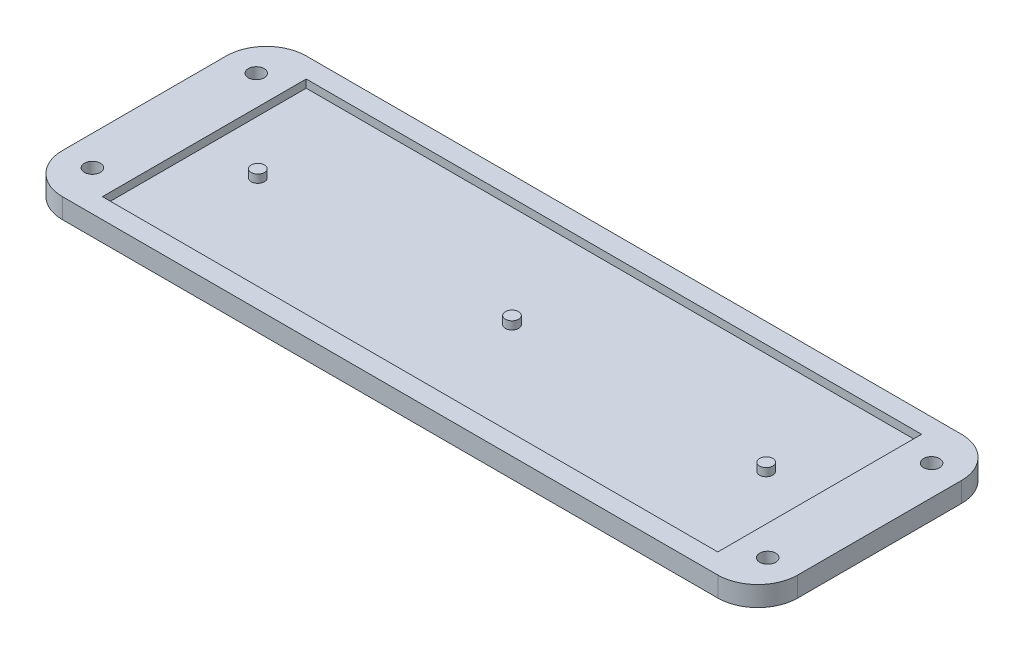
ISO-10303-21;
HEADER;
FILE_DESCRIPTION(('STEP AP214'),'2;1');
FILE_NAME('part.step','',(''),(''),'','','');
FILE_SCHEMA(('AUTOMOTIVE_DESIGN { 1 0 10303 214 1 1 1 1 }'));
ENDSEC;
DATA;
#1=APPLICATION_CONTEXT('core data for automotive mechanical design processes');
#2=APPLICATION_PROTOCOL_DEFINITION('international standard','automotive_design',2000,#1);
#3=PRODUCT_CONTEXT('',#1,'mechanical');
#4=PRODUCT('Part','Part','',(#3));
#5=PRODUCT_RELATED_PRODUCT_CATEGORY('part','',(#4));
#6=PRODUCT_DEFINITION_FORMATION('','',#4);
#7=PRODUCT_DEFINITION_CONTEXT('part definition',#1,'design');
#8=PRODUCT_DEFINITION('design','',#6,#7);
#9=PRODUCT_DEFINITION_SHAPE('','',#8);
#10=(LENGTH_UNIT() NAMED_UNIT(*) SI_UNIT(.MILLI.,.METRE.));
#11=(NAMED_UNIT(*) PLANE_ANGLE_UNIT() SI_UNIT($,.RADIAN.));
#12=(NAMED_UNIT(*) SI_UNIT($,.STERADIAN.) SOLID_ANGLE_UNIT());
#13=UNCERTAINTY_MEASURE_WITH_UNIT(LENGTH_MEASURE(1.E-05),#10,'distance_accuracy_value','');
#14=(GEOMETRIC_REPRESENTATION_CONTEXT(3) GLOBAL_UNCERTAINTY_ASSIGNED_CONTEXT((#13)) GLOBAL_UNIT_ASSIGNED_CONTEXT((#10,
#11,#12)) REPRESENTATION_CONTEXT('',''));
#15=CARTESIAN_POINT('',(0.,0.,0.));
#16=DIRECTION('',(0.,0.,1.));
#17=DIRECTION('',(1.,0.,0.));
#18=AXIS2_PLACEMENT_3D('',#15,#16,#17);
#19=CARTESIAN_POINT('',(0.,5.,0.));
#20=DIRECTION('',(0.,1.,0.));
#21=DIRECTION('',(0.,0.,1.));
#22=AXIS2_PLACEMENT_3D('',#19,#20,#21);
#23=PLANE('',#22);
#24=DIRECTION('',(0.,0.,-1.));
#25=VECTOR('',#24,1.);
#26=CARTESIAN_POINT('',(169.,5.,-56.));
#27=LINE('',#26,#25);
#28=CARTESIAN_POINT('',(169.,5.,-5.00000000000001));
#29=VERTEX_POINT('',#28);
#30=CARTESIAN_POINT('',(169.,5.,-56.));
#31=VERTEX_POINT('',#30);
#32=EDGE_CURVE('E140',#29,#31,#27,.T.);
#33=ORIENTED_EDGE('',*,*,#32,.F.);
#34=DIRECTION('',(1.,0.,0.));
#35=VECTOR('',#34,1.);
#36=CARTESIAN_POINT('',(15.,5.,-5.00000000000001));
#37=LINE('',#36,#35);
#38=CARTESIAN_POINT('',(15.,5.,-5.00000000000001));
#39=VERTEX_POINT('',#38);
#40=EDGE_CURVE('E160',#39,#29,#37,.T.);
#41=ORIENTED_EDGE('',*,*,#40,.F.);
#42=DIRECTION('',(0.,0.,1.));
#43=VECTOR('',#42,1.);
#44=CARTESIAN_POINT('',(15.,5.,-56.));
#45=LINE('',#44,#43);
#46=CARTESIAN_POINT('',(15.,5.,-56.));
#47=VERTEX_POINT('',#46);
#48=EDGE_CURVE('E164',#47,#39,#45,.T.);
#49=ORIENTED_EDGE('',*,*,#48,.F.);
#50=DIRECTION('',(-1.,0.,0.));
#51=VECTOR('',#50,1.);
#52=CARTESIAN_POINT('',(15.,5.,-56.));
#53=LINE('',#52,#51);
#54=EDGE_CURVE('E176',#31,#47,#53,.T.);
#55=ORIENTED_EDGE('',*,*,#54,.F.);
#56=EDGE_LOOP('',(#33,#41,#49,#55));
#57=FACE_BOUND('',#56,.T.);
#58=CARTESIAN_POINT('',(176.5,5.,-51.0000000000001));
#59=DIRECTION('',(0.,1.,0.));
#60=DIRECTION('',(0.,0.,1.));
#61=AXIS2_PLACEMENT_3D('',#58,#59,#60);
#62=CIRCLE('',#61,2.);
#63=CARTESIAN_POINT('',(176.5,5.,-49.0000000000001));
#64=VERTEX_POINT('',#63);
#65=EDGE_CURVE('E200',#64,#64,#62,.T.);
#66=ORIENTED_EDGE('',*,*,#65,.F.);
#67=EDGE_LOOP('',(#66));
#68=FACE_BOUND('',#67,.T.);
#69=CARTESIAN_POINT('',(176.5,5.,-10.));
#70=DIRECTION('',(0.,1.,0.));
#71=DIRECTION('',(0.,0.,-1.));
#72=AXIS2_PLACEMENT_3D('',#69,#70,#71);
#73=CIRCLE('',#72,2.);
#74=CARTESIAN_POINT('',(176.5,5.,-12.));
#75=VERTEX_POINT('',#74);
#76=EDGE_CURVE('E216',#75,#75,#73,.T.);
#77=ORIENTED_EDGE('',*,*,#76,.F.);
#78=EDGE_LOOP('',(#77));
#79=FACE_BOUND('',#78,.T.);
#80=DIRECTION('',(-1.,0.,0.));
#81=VECTOR('',#80,1.);
#82=CARTESIAN_POINT('',(184.,5.,-61.));
#83=LINE('',#82,#81);
#84=CARTESIAN_POINT('',(174.,5.,-61.));
#85=VERTEX_POINT('',#84);
#86=CARTESIAN_POINT('',(10.,5.,-61.));
#87=VERTEX_POINT('',#86);
#88=EDGE_CURVE('E235',#85,#87,#83,.T.);
#89=ORIENTED_EDGE('',*,*,#88,.T.);
#90=CARTESIAN_POINT('',(10.,5.,-51.));
#91=DIRECTION('',(0.,1.,0.));
#92=DIRECTION('',(0.,0.,1.));
#93=AXIS2_PLACEMENT_3D('',#90,#91,#92);
#94=CIRCLE('',#93,10.);
#95=CARTESIAN_POINT('',(0.,5.,-51.));
#96=VERTEX_POINT('',#95);
#97=EDGE_CURVE('E286',#87,#96,#94,.T.);
#98=ORIENTED_EDGE('',*,*,#97,.T.);
#99=DIRECTION('',(0.,0.,1.));
#100=VECTOR('',#99,1.);
#101=CARTESIAN_POINT('',(0.,5.,-61.));
#102=LINE('',#101,#100);
#103=CARTESIAN_POINT('',(0.,5.,-10.));
#104=VERTEX_POINT('',#103);
#105=EDGE_CURVE('E224',#96,#104,#102,.T.);
#106=ORIENTED_EDGE('',*,*,#105,.T.);
#107=CARTESIAN_POINT('',(10.,5.,-10.));
#108=DIRECTION('',(0.,1.,0.));
#109=DIRECTION('',(0.,0.,1.));
#110=AXIS2_PLACEMENT_3D('',#107,#108,#109);
#111=CIRCLE('',#110,10.);
#112=CARTESIAN_POINT('',(10.,5.,0.));
#113=VERTEX_POINT('',#112);
#114=EDGE_CURVE('E283',#104,#113,#111,.T.);
#115=ORIENTED_EDGE('',*,*,#114,.T.);
#116=DIRECTION('',(1.,0.,0.));
#117=VECTOR('',#116,1.);
#118=CARTESIAN_POINT('',(0.,5.,0.));
#119=LINE('',#118,#117);
#120=CARTESIAN_POINT('',(174.,5.,0.));
#121=VERTEX_POINT('',#120);
#122=EDGE_CURVE('E228',#113,#121,#119,.T.);
#123=ORIENTED_EDGE('',*,*,#122,.T.);
#124=CARTESIAN_POINT('',(174.,5.,-9.99999999999998));
#125=DIRECTION('',(0.,1.,0.));
#126=DIRECTION('',(0.,0.,1.));
#127=AXIS2_PLACEMENT_3D('',#124,#125,#126);
#128=CIRCLE('',#127,10.);
#129=CARTESIAN_POINT('',(184.,5.,-9.99999999999998));
#130=VERTEX_POINT('',#129);
#131=EDGE_CURVE('E64',#121,#130,#128,.T.);
#132=ORIENTED_EDGE('',*,*,#131,.T.);
#133=DIRECTION('',(0.,0.,-1.));
#134=VECTOR('',#133,1.);
#135=CARTESIAN_POINT('',(184.,5.,0.));
#136=LINE('',#135,#134);
#137=CARTESIAN_POINT('',(184.,5.,-51.));
#138=VERTEX_POINT('',#137);
#139=EDGE_CURVE('E232',#130,#138,#136,.T.);
#140=ORIENTED_EDGE('',*,*,#139,.T.);
#141=CARTESIAN_POINT('',(174.,5.,-51.));
#142=DIRECTION('',(0.,1.,0.));
#143=DIRECTION('',(0.,0.,1.));
#144=AXIS2_PLACEMENT_3D('',#141,#142,#143);
#145=CIRCLE('',#144,10.);
#146=EDGE_CURVE('E280',#138,#85,#145,.T.);
#147=ORIENTED_EDGE('',*,*,#146,.T.);
#148=EDGE_LOOP('',(#89,#98,#106,#115,#123,#132,#140,#147));
#149=FACE_BOUND('',#148,.T.);
#150=CARTESIAN_POINT('',(7.50000000000001,5.,-10.));
#151=DIRECTION('',(0.,1.,0.));
#152=DIRECTION('',(0.,0.,1.));
#153=AXIS2_PLACEMENT_3D('',#150,#151,#152);
#154=CIRCLE('',#153,2.);
#155=CARTESIAN_POINT('',(7.50000000000001,5.,-8.));
#156=VERTEX_POINT('',#155);
#157=EDGE_CURVE('E208',#156,#156,#154,.T.);
#158=ORIENTED_EDGE('',*,*,#157,.F.);
#159=EDGE_LOOP('',(#158));
#160=FACE_BOUND('',#159,.T.);
#161=CARTESIAN_POINT('',(7.5,5.,-51.));
#162=DIRECTION('',(0.,1.,0.));
#163=DIRECTION('',(0.,0.,-1.));
#164=AXIS2_PLACEMENT_3D('',#161,#162,#163);
#165=CIRCLE('',#164,2.);
#166=CARTESIAN_POINT('',(7.5,5.,-53.));
#167=VERTEX_POINT('',#166);
#168=EDGE_CURVE('E192',#167,#167,#165,.T.);
#169=ORIENTED_EDGE('',*,*,#168,.F.);
#170=EDGE_LOOP('',(#169));
#171=FACE_BOUND('',#170,.T.);
#172=ADVANCED_FACE('F43',(#57,#68,#79,#149,#160,#171),#23,.T.);
#173=CARTESIAN_POINT('',(0.,0.,0.));
#174=DIRECTION('',(0.,1.,0.));
#175=DIRECTION('',(0.,0.,1.));
#176=AXIS2_PLACEMENT_3D('',#173,#174,#175);
#177=PLANE('',#176);
#178=DIRECTION('',(0.,0.,1.));
#179=VECTOR('',#178,1.);
#180=CARTESIAN_POINT('',(0.,0.,-61.));
#181=LINE('',#180,#179);
#182=CARTESIAN_POINT('',(0.,0.,-51.));
#183=VERTEX_POINT('',#182);
#184=CARTESIAN_POINT('',(0.,0.,-10.));
#185=VERTEX_POINT('',#184);
#186=EDGE_CURVE('E220',#183,#185,#181,.T.);
#187=ORIENTED_EDGE('',*,*,#186,.F.);
#188=CARTESIAN_POINT('',(10.,0.,-51.));
#189=DIRECTION('',(0.,1.,0.));
#190=DIRECTION('',(0.,0.,1.));
#191=AXIS2_PLACEMENT_3D('',#188,#189,#190);
#192=CIRCLE('',#191,10.);
#193=CARTESIAN_POINT('',(10.,0.,-61.));
#194=VERTEX_POINT('',#193);
#195=EDGE_CURVE('E268',#183,#194,#192,.F.);
#196=ORIENTED_EDGE('',*,*,#195,.T.);
#197=DIRECTION('',(-1.,0.,0.));
#198=VECTOR('',#197,1.);
#199=CARTESIAN_POINT('',(184.,0.,-61.));
#200=LINE('',#199,#198);
#201=CARTESIAN_POINT('',(174.,0.,-61.));
#202=VERTEX_POINT('',#201);
#203=EDGE_CURVE('E229',#202,#194,#200,.T.);
#204=ORIENTED_EDGE('',*,*,#203,.F.);
#205=CARTESIAN_POINT('',(174.,0.,-51.));
#206=DIRECTION('',(0.,1.,0.));
#207=DIRECTION('',(0.,0.,1.));
#208=AXIS2_PLACEMENT_3D('',#205,#206,#207);
#209=CIRCLE('',#208,10.);
#210=CARTESIAN_POINT('',(184.,0.,-51.));
#211=VERTEX_POINT('',#210);
#212=EDGE_CURVE('E262',#202,#211,#209,.F.);
#213=ORIENTED_EDGE('',*,*,#212,.T.);
#214=DIRECTION('',(0.,0.,-1.));
#215=VECTOR('',#214,1.);
#216=CARTESIAN_POINT('',(184.,0.,0.));
#217=LINE('',#216,#215);
#218=CARTESIAN_POINT('',(184.,0.,-9.99999999999998));
#219=VERTEX_POINT('',#218);
#220=EDGE_CURVE('E247',#219,#211,#217,.T.);
#221=ORIENTED_EDGE('',*,*,#220,.F.);
#222=CARTESIAN_POINT('',(174.,0.,-9.99999999999998));
#223=DIRECTION('',(0.,1.,0.));
#224=DIRECTION('',(0.,0.,1.));
#225=AXIS2_PLACEMENT_3D('',#222,#223,#224);
#226=CIRCLE('',#225,10.);
#227=CARTESIAN_POINT('',(174.,0.,0.));
#228=VERTEX_POINT('',#227);
#229=EDGE_CURVE('E259',#219,#228,#226,.F.);
#230=ORIENTED_EDGE('',*,*,#229,.T.);
#231=DIRECTION('',(1.,0.,0.));
#232=VECTOR('',#231,1.);
#233=CARTESIAN_POINT('',(0.,0.,0.));
#234=LINE('',#233,#232);
#235=CARTESIAN_POINT('',(10.,0.,0.));
#236=VERTEX_POINT('',#235);
#237=EDGE_CURVE('E243',#236,#228,#234,.T.);
#238=ORIENTED_EDGE('',*,*,#237,.F.);
#239=CARTESIAN_POINT('',(10.,0.,-10.));
#240=DIRECTION('',(0.,1.,0.));
#241=DIRECTION('',(0.,0.,1.));
#242=AXIS2_PLACEMENT_3D('',#239,#240,#241);
#243=CIRCLE('',#242,10.);
#244=EDGE_CURVE('E265',#236,#185,#243,.F.);
#245=ORIENTED_EDGE('',*,*,#244,.T.);
#246=EDGE_LOOP('',(#187,#196,#204,#213,#221,#230,#238,#245));
#247=FACE_BOUND('',#246,.T.);
#248=CARTESIAN_POINT('',(176.5,0.,-10.));
#249=DIRECTION('',(0.,1.,0.));
#250=DIRECTION('',(0.,0.,-1.));
#251=AXIS2_PLACEMENT_3D('',#248,#249,#250);
#252=CIRCLE('',#251,2.);
#253=CARTESIAN_POINT('',(176.5,0.,-12.));
#254=VERTEX_POINT('',#253);
#255=EDGE_CURVE('E212',#254,#254,#252,.T.);
#256=ORIENTED_EDGE('',*,*,#255,.T.);
#257=EDGE_LOOP('',(#256));
#258=FACE_BOUND('',#257,.T.);
#259=CARTESIAN_POINT('',(7.50000000000001,0.,-10.));
#260=DIRECTION('',(0.,1.,0.));
#261=DIRECTION('',(0.,0.,1.));
#262=AXIS2_PLACEMENT_3D('',#259,#260,#261);
#263=CIRCLE('',#262,2.);
#264=CARTESIAN_POINT('',(7.50000000000001,0.,-8.));
#265=VERTEX_POINT('',#264);
#266=EDGE_CURVE('E204',#265,#265,#263,.T.);
#267=ORIENTED_EDGE('',*,*,#266,.T.);
#268=EDGE_LOOP('',(#267));
#269=FACE_BOUND('',#268,.T.);
#270=CARTESIAN_POINT('',(176.5,0.,-51.0000000000001));
#271=DIRECTION('',(0.,1.,0.));
#272=DIRECTION('',(0.,0.,1.));
#273=AXIS2_PLACEMENT_3D('',#270,#271,#272);
#274=CIRCLE('',#273,2.);
#275=CARTESIAN_POINT('',(176.5,0.,-49.0000000000001));
#276=VERTEX_POINT('',#275);
#277=EDGE_CURVE('E196',#276,#276,#274,.T.);
#278=ORIENTED_EDGE('',*,*,#277,.T.);
#279=EDGE_LOOP('',(#278));
#280=FACE_BOUND('',#279,.T.);
#281=CARTESIAN_POINT('',(7.5,0.,-51.));
#282=DIRECTION('',(0.,1.,0.));
#283=DIRECTION('',(0.,0.,-1.));
#284=AXIS2_PLACEMENT_3D('',#281,#282,#283);
#285=CIRCLE('',#284,2.);
#286=CARTESIAN_POINT('',(7.5,0.,-53.));
#287=VERTEX_POINT('',#286);
#288=EDGE_CURVE('E186',#287,#287,#285,.T.);
#289=ORIENTED_EDGE('',*,*,#288,.T.);
#290=EDGE_LOOP('',(#289));
#291=FACE_BOUND('',#290,.T.);
#292=ADVANCED_FACE('F303',(#247,#258,#269,#280,#291),#177,.F.);
#293=CARTESIAN_POINT('',(0.,5.,-61.));
#294=DIRECTION('',(1.,0.,0.));
#295=DIRECTION('',(0.,0.,-1.));
#296=AXIS2_PLACEMENT_3D('',#293,#294,#295);
#297=PLANE('',#296);
#298=ORIENTED_EDGE('',*,*,#105,.F.);
#299=DIRECTION('',(0.,-1.,0.));
#300=VECTOR('',#299,1.);
#301=CARTESIAN_POINT('',(0.,5.,-51.));
#302=LINE('',#301,#300);
#303=EDGE_CURVE('E255',#96,#183,#302,.T.);
#304=ORIENTED_EDGE('',*,*,#303,.T.);
#305=ORIENTED_EDGE('',*,*,#186,.T.);
#306=DIRECTION('',(0.,-1.,0.));
#307=VECTOR('',#306,1.);
#308=CARTESIAN_POINT('',(0.,5.,-9.99999999999999));
#309=LINE('',#308,#307);
#310=EDGE_CURVE('E239',#185,#104,#309,.F.);
#311=ORIENTED_EDGE('',*,*,#310,.T.);
#312=EDGE_LOOP('',(#298,#304,#305,#311));
#313=FACE_BOUND('',#312,.T.);
#314=ADVANCED_FACE('F322',(#313),#297,.F.);
#315=CARTESIAN_POINT('',(0.,5.,0.));
#316=DIRECTION('',(0.,0.,-1.));
#317=DIRECTION('',(-1.,0.,0.));
#318=AXIS2_PLACEMENT_3D('',#315,#316,#317);
#319=PLANE('',#318);
#320=ORIENTED_EDGE('',*,*,#122,.F.);
#321=DIRECTION('',(0.,-1.,0.));
#322=VECTOR('',#321,1.);
#323=CARTESIAN_POINT('',(10.,5.,0.));
#324=LINE('',#323,#322);
#325=EDGE_CURVE('E292',#113,#236,#324,.T.);
#326=ORIENTED_EDGE('',*,*,#325,.T.);
#327=ORIENTED_EDGE('',*,*,#237,.T.);
#328=DIRECTION('',(0.,-1.,0.));
#329=VECTOR('',#328,1.);
#330=CARTESIAN_POINT('',(174.,5.,0.));
#331=LINE('',#330,#329);
#332=EDGE_CURVE('E289',#228,#121,#331,.F.);
#333=ORIENTED_EDGE('',*,*,#332,.T.);
#334=EDGE_LOOP('',(#320,#326,#327,#333));
#335=FACE_BOUND('',#334,.T.);
#336=ADVANCED_FACE('F330',(#335),#319,.F.);
#337=CARTESIAN_POINT('',(184.,5.,0.));
#338=DIRECTION('',(-1.,0.,0.));
#339=DIRECTION('',(0.,0.,1.));
#340=AXIS2_PLACEMENT_3D('',#337,#338,#339);
#341=PLANE('',#340);
#342=ORIENTED_EDGE('',*,*,#220,.T.);
#343=DIRECTION('',(0.,-1.,0.));
#344=VECTOR('',#343,1.);
#345=CARTESIAN_POINT('',(184.,5.,-51.));
#346=LINE('',#345,#344);
#347=EDGE_CURVE('E11',#211,#138,#346,.F.);
#348=ORIENTED_EDGE('',*,*,#347,.T.);
#349=ORIENTED_EDGE('',*,*,#139,.F.);
#350=DIRECTION('',(0.,-1.,0.));
#351=VECTOR('',#350,1.);
#352=CARTESIAN_POINT('',(184.,5.,-9.99999999999998));
#353=LINE('',#352,#351);
#354=EDGE_CURVE('E52',#130,#219,#353,.T.);
#355=ORIENTED_EDGE('',*,*,#354,.T.);
#356=EDGE_LOOP('',(#342,#348,#349,#355));
#357=FACE_BOUND('',#356,.T.);
#358=ADVANCED_FACE('F299',(#357),#341,.F.);
#359=CARTESIAN_POINT('',(184.,5.,-61.));
#360=DIRECTION('',(0.,0.,1.));
#361=DIRECTION('',(1.,0.,0.));
#362=AXIS2_PLACEMENT_3D('',#359,#360,#361);
#363=PLANE('',#362);
#364=ORIENTED_EDGE('',*,*,#203,.T.);
#365=DIRECTION('',(0.,-1.,0.));
#366=VECTOR('',#365,1.);
#367=CARTESIAN_POINT('',(10.,5.,-61.));
#368=LINE('',#367,#366);
#369=EDGE_CURVE('E275',#194,#87,#368,.F.);
#370=ORIENTED_EDGE('',*,*,#369,.T.);
#371=ORIENTED_EDGE('',*,*,#88,.F.);
#372=DIRECTION('',(0.,-1.,0.));
#373=VECTOR('',#372,1.);
#374=CARTESIAN_POINT('',(174.,5.,-61.));
#375=LINE('',#374,#373);
#376=EDGE_CURVE('E271',#85,#202,#375,.T.);
#377=ORIENTED_EDGE('',*,*,#376,.T.);
#378=EDGE_LOOP('',(#364,#370,#371,#377));
#379=FACE_BOUND('',#378,.T.);
#380=ADVANCED_FACE('F313',(#379),#363,.F.);
#381=CARTESIAN_POINT('',(176.5,5.,-10.));
#382=DIRECTION('',(0.,-1.,0.));
#383=DIRECTION('',(0.,0.,-1.));
#384=AXIS2_PLACEMENT_3D('',#381,#382,#383);
#385=CYLINDRICAL_SURFACE('',#384,2.);
#386=ORIENTED_EDGE('',*,*,#76,.T.);
#387=EDGE_LOOP('',(#386));
#388=FACE_BOUND('',#387,.T.);
#389=ORIENTED_EDGE('',*,*,#255,.F.);
#390=EDGE_LOOP('',(#389));
#391=FACE_BOUND('',#390,.T.);
#392=ADVANCED_FACE('F424',(#388,#391),#385,.F.);
#393=CARTESIAN_POINT('',(7.50000000000001,5.,-10.));
#394=DIRECTION('',(0.,-1.,0.));
#395=DIRECTION('',(0.,0.,-1.));
#396=AXIS2_PLACEMENT_3D('',#393,#394,#395);
#397=CYLINDRICAL_SURFACE('',#396,2.);
#398=ORIENTED_EDGE('',*,*,#157,.T.);
#399=EDGE_LOOP('',(#398));
#400=FACE_BOUND('',#399,.T.);
#401=ORIENTED_EDGE('',*,*,#266,.F.);
#402=EDGE_LOOP('',(#401));
#403=FACE_BOUND('',#402,.T.);
#404=ADVANCED_FACE('F421',(#400,#403),#397,.F.);
#405=CARTESIAN_POINT('',(176.5,5.,-51.0000000000001));
#406=DIRECTION('',(0.,-1.,0.));
#407=DIRECTION('',(0.,0.,-1.));
#408=AXIS2_PLACEMENT_3D('',#405,#406,#407);
#409=CYLINDRICAL_SURFACE('',#408,2.);
#410=ORIENTED_EDGE('',*,*,#65,.T.);
#411=EDGE_LOOP('',(#410));
#412=FACE_BOUND('',#411,.T.);
#413=ORIENTED_EDGE('',*,*,#277,.F.);
#414=EDGE_LOOP('',(#413));
#415=FACE_BOUND('',#414,.T.);
#416=ADVANCED_FACE('F417',(#412,#415),#409,.F.);
#417=CARTESIAN_POINT('',(7.5,5.,-51.));
#418=DIRECTION('',(0.,-1.,0.));
#419=DIRECTION('',(0.,0.,-1.));
#420=AXIS2_PLACEMENT_3D('',#417,#418,#419);
#421=CYLINDRICAL_SURFACE('',#420,2.);
#422=ORIENTED_EDGE('',*,*,#168,.T.);
#423=EDGE_LOOP('',(#422));
#424=FACE_BOUND('',#423,.T.);
#425=ORIENTED_EDGE('',*,*,#288,.F.);
#426=EDGE_LOOP('',(#425));
#427=FACE_BOUND('',#426,.T.);
#428=ADVANCED_FACE('F414',(#424,#427),#421,.F.);
#429=CARTESIAN_POINT('',(169.,3.,-56.));
#430=DIRECTION('',(1.,0.,0.));
#431=DIRECTION('',(0.,0.,-1.));
#432=AXIS2_PLACEMENT_3D('',#429,#430,#431);
#433=PLANE('',#432);
#434=ORIENTED_EDGE('',*,*,#32,.T.);
#435=DIRECTION('',(0.,1.,0.));
#436=VECTOR('',#435,1.);
#437=CARTESIAN_POINT('',(169.,3.,-56.));
#438=LINE('',#437,#436);
#439=CARTESIAN_POINT('',(169.,3.,-56.));
#440=VERTEX_POINT('',#439);
#441=EDGE_CURVE('E133',#440,#31,#438,.T.);
#442=ORIENTED_EDGE('',*,*,#441,.F.);
#443=DIRECTION('',(0.,0.,-1.));
#444=VECTOR('',#443,1.);
#445=CARTESIAN_POINT('',(169.,3.,-56.));
#446=LINE('',#445,#444);
#447=CARTESIAN_POINT('',(169.,3.,-5.00000000000001));
#448=VERTEX_POINT('',#447);
#449=EDGE_CURVE('E137',#448,#440,#446,.T.);
#450=ORIENTED_EDGE('',*,*,#449,.F.);
#451=DIRECTION('',(0.,1.,0.));
#452=VECTOR('',#451,1.);
#453=CARTESIAN_POINT('',(169.,3.,-5.00000000000001));
#454=LINE('',#453,#452);
#455=EDGE_CURVE('E183',#448,#29,#454,.T.);
#456=ORIENTED_EDGE('',*,*,#455,.T.);
#457=EDGE_LOOP('',(#434,#442,#450,#456));
#458=FACE_BOUND('',#457,.T.);
#459=ADVANCED_FACE('F135',(#458),#433,.F.);
#460=CARTESIAN_POINT('',(15.,3.,-5.00000000000001));
#461=DIRECTION('',(0.,0.,1.));
#462=DIRECTION('',(1.,0.,0.));
#463=AXIS2_PLACEMENT_3D('',#460,#461,#462);
#464=PLANE('',#463);
#465=ORIENTED_EDGE('',*,*,#40,.T.);
#466=ORIENTED_EDGE('',*,*,#455,.F.);
#467=DIRECTION('',(1.,0.,0.));
#468=VECTOR('',#467,1.);
#469=CARTESIAN_POINT('',(15.,3.,-5.00000000000001));
#470=LINE('',#469,#468);
#471=CARTESIAN_POINT('',(15.,3.,-5.00000000000001));
#472=VERTEX_POINT('',#471);
#473=EDGE_CURVE('E146',#472,#448,#470,.T.);
#474=ORIENTED_EDGE('',*,*,#473,.F.);
#475=DIRECTION('',(0.,1.,0.));
#476=VECTOR('',#475,1.);
#477=CARTESIAN_POINT('',(15.,3.,-5.00000000000001));
#478=LINE('',#477,#476);
#479=EDGE_CURVE('E187',#472,#39,#478,.T.);
#480=ORIENTED_EDGE('',*,*,#479,.T.);
#481=EDGE_LOOP('',(#465,#466,#474,#480));
#482=FACE_BOUND('',#481,.T.);
#483=ADVANCED_FACE('F402',(#482),#464,.F.);
#484=CARTESIAN_POINT('',(15.,3.,-56.));
#485=DIRECTION('',(-1.,0.,0.));
#486=DIRECTION('',(0.,0.,1.));
#487=AXIS2_PLACEMENT_3D('',#484,#485,#486);
#488=PLANE('',#487);
#489=ORIENTED_EDGE('',*,*,#48,.T.);
#490=ORIENTED_EDGE('',*,*,#479,.F.);
#491=DIRECTION('',(0.,0.,1.));
#492=VECTOR('',#491,1.);
#493=CARTESIAN_POINT('',(15.,3.,-56.));
#494=LINE('',#493,#492);
#495=CARTESIAN_POINT('',(15.,3.,-56.));
#496=VERTEX_POINT('',#495);
#497=EDGE_CURVE('E155',#496,#472,#494,.T.);
#498=ORIENTED_EDGE('',*,*,#497,.F.);
#499=DIRECTION('',(0.,1.,0.));
#500=VECTOR('',#499,1.);
#501=CARTESIAN_POINT('',(15.,3.,-56.));
#502=LINE('',#501,#500);
#503=EDGE_CURVE('E145',#496,#47,#502,.T.);
#504=ORIENTED_EDGE('',*,*,#503,.T.);
#505=EDGE_LOOP('',(#489,#490,#498,#504));
#506=FACE_BOUND('',#505,.T.);
#507=ADVANCED_FACE('F405',(#506),#488,.F.);
#508=CARTESIAN_POINT('',(15.,3.,-56.));
#509=DIRECTION('',(0.,0.,-1.));
#510=DIRECTION('',(-1.,0.,0.));
#511=AXIS2_PLACEMENT_3D('',#508,#509,#510);
#512=PLANE('',#511);
#513=ORIENTED_EDGE('',*,*,#54,.T.);
#514=ORIENTED_EDGE('',*,*,#503,.F.);
#515=DIRECTION('',(-1.,0.,0.));
#516=VECTOR('',#515,1.);
#517=CARTESIAN_POINT('',(15.,3.,-56.));
#518=LINE('',#517,#516);
#519=EDGE_CURVE('E149',#440,#496,#518,.T.);
#520=ORIENTED_EDGE('',*,*,#519,.F.);
#521=ORIENTED_EDGE('',*,*,#441,.T.);
#522=EDGE_LOOP('',(#513,#514,#520,#521));
#523=FACE_BOUND('',#522,.T.);
#524=ADVANCED_FACE('F150',(#523),#512,.F.);
#525=CARTESIAN_POINT('',(0.,3.,0.));
#526=DIRECTION('',(0.,1.,0.));
#527=DIRECTION('',(0.,0.,1.));
#528=AXIS2_PLACEMENT_3D('',#525,#526,#527);
#529=PLANE('',#528);
#530=CARTESIAN_POINT('',(155.6,3.,-30.5));
#531=DIRECTION('',(0.,1.,0.));
#532=DIRECTION('',(0.,0.,1.));
#533=AXIS2_PLACEMENT_3D('',#530,#531,#532);
#534=CIRCLE('',#533,1.65000000000002);
#535=CARTESIAN_POINT('',(155.6,3.,-28.85));
#536=VERTEX_POINT('',#535);
#537=EDGE_CURVE('E372',#536,#536,#534,.T.);
#538=ORIENTED_EDGE('',*,*,#537,.F.);
#539=EDGE_LOOP('',(#538));
#540=FACE_BOUND('',#539,.T.);
#541=CARTESIAN_POINT('',(28.4,3.,-30.5));
#542=DIRECTION('',(0.,1.,0.));
#543=DIRECTION('',(0.,0.,1.));
#544=AXIS2_PLACEMENT_3D('',#541,#542,#543);
#545=CIRCLE('',#544,1.65);
#546=CARTESIAN_POINT('',(28.4,3.,-28.85));
#547=VERTEX_POINT('',#546);
#548=EDGE_CURVE('E371',#547,#547,#545,.T.);
#549=ORIENTED_EDGE('',*,*,#548,.F.);
#550=EDGE_LOOP('',(#549));
#551=FACE_BOUND('',#550,.T.);
#552=CARTESIAN_POINT('',(92.,3.,-30.5));
#553=DIRECTION('',(0.,1.,0.));
#554=DIRECTION('',(0.,0.,1.));
#555=AXIS2_PLACEMENT_3D('',#552,#553,#554);
#556=CIRCLE('',#555,1.65);
#557=CARTESIAN_POINT('',(92.,3.,-28.85));
#558=VERTEX_POINT('',#557);
#559=EDGE_CURVE('E177',#558,#558,#556,.T.);
#560=ORIENTED_EDGE('',*,*,#559,.F.);
#561=EDGE_LOOP('',(#560));
#562=FACE_BOUND('',#561,.T.);
#563=ORIENTED_EDGE('',*,*,#449,.T.);
#564=ORIENTED_EDGE('',*,*,#519,.T.);
#565=ORIENTED_EDGE('',*,*,#497,.T.);
#566=ORIENTED_EDGE('',*,*,#473,.T.);
#567=EDGE_LOOP('',(#563,#564,#565,#566));
#568=FACE_BOUND('',#567,.T.);
#569=ADVANCED_FACE('F157',(#540,#551,#562,#568),#529,.T.);
#570=CARTESIAN_POINT('',(92.,3.,-30.5));
#571=DIRECTION('',(0.,1.,0.));
#572=DIRECTION('',(0.,0.,1.));
#573=AXIS2_PLACEMENT_3D('',#570,#571,#572);
#574=CYLINDRICAL_SURFACE('',#573,1.65);
#575=ORIENTED_EDGE('',*,*,#559,.T.);
#576=EDGE_LOOP('',(#575));
#577=FACE_BOUND('',#576,.T.);
#578=CARTESIAN_POINT('',(92.,5.,-30.5));
#579=DIRECTION('',(0.,1.,0.));
#580=DIRECTION('',(0.,0.,1.));
#581=AXIS2_PLACEMENT_3D('',#578,#579,#580);
#582=CIRCLE('',#581,1.65);
#583=CARTESIAN_POINT('',(92.,5.,-28.85));
#584=VERTEX_POINT('',#583);
#585=EDGE_CURVE('E167',#584,#584,#582,.T.);
#586=ORIENTED_EDGE('',*,*,#585,.F.);
#587=EDGE_LOOP('',(#586));
#588=FACE_BOUND('',#587,.T.);
#589=ADVANCED_FACE('F390',(#577,#588),#574,.T.);
#590=CARTESIAN_POINT('',(28.4,3.,-30.5));
#591=DIRECTION('',(0.,1.,0.));
#592=DIRECTION('',(0.,0.,1.));
#593=AXIS2_PLACEMENT_3D('',#590,#591,#592);
#594=CYLINDRICAL_SURFACE('',#593,1.65);
#595=ORIENTED_EDGE('',*,*,#548,.T.);
#596=EDGE_LOOP('',(#595));
#597=FACE_BOUND('',#596,.T.);
#598=CARTESIAN_POINT('',(28.4,5.,-30.5));
#599=DIRECTION('',(0.,1.,0.));
#600=DIRECTION('',(0.,0.,1.));
#601=AXIS2_PLACEMENT_3D('',#598,#599,#600);
#602=CIRCLE('',#601,1.65);
#603=CARTESIAN_POINT('',(28.4,5.,-28.85));
#604=VERTEX_POINT('',#603);
#605=EDGE_CURVE('E368',#604,#604,#602,.T.);
#606=ORIENTED_EDGE('',*,*,#605,.F.);
#607=EDGE_LOOP('',(#606));
#608=FACE_BOUND('',#607,.T.);
#609=ADVANCED_FACE('F363',(#597,#608),#594,.T.);
#610=CARTESIAN_POINT('',(155.6,3.,-30.5));
#611=DIRECTION('',(0.,1.,0.));
#612=DIRECTION('',(0.,0.,1.));
#613=AXIS2_PLACEMENT_3D('',#610,#611,#612);
#614=CYLINDRICAL_SURFACE('',#613,1.65000000000002);
#615=ORIENTED_EDGE('',*,*,#537,.T.);
#616=EDGE_LOOP('',(#615));
#617=FACE_BOUND('',#616,.T.);
#618=CARTESIAN_POINT('',(155.6,5.,-30.5));
#619=DIRECTION('',(0.,1.,0.));
#620=DIRECTION('',(0.,0.,1.));
#621=AXIS2_PLACEMENT_3D('',#618,#619,#620);
#622=CIRCLE('',#621,1.65000000000002);
#623=CARTESIAN_POINT('',(155.6,5.,-28.85));
#624=VERTEX_POINT('',#623);
#625=EDGE_CURVE('E379',#624,#624,#622,.T.);
#626=ORIENTED_EDGE('',*,*,#625,.F.);
#627=EDGE_LOOP('',(#626));
#628=FACE_BOUND('',#627,.T.);
#629=ADVANCED_FACE('F358',(#617,#628),#614,.T.);
#630=ORIENTED_EDGE('',*,*,#605,.T.);
#631=EDGE_LOOP('',(#630));
#632=FACE_BOUND('',#631,.T.);
#633=ADVANCED_FACE('F348',(#632),#23,.T.);
#634=ORIENTED_EDGE('',*,*,#585,.T.);
#635=EDGE_LOOP('',(#634));
#636=FACE_BOUND('',#635,.T.);
#637=ADVANCED_FACE('F339',(#636),#23,.T.);
#638=ORIENTED_EDGE('',*,*,#625,.T.);
#639=EDGE_LOOP('',(#638));
#640=FACE_BOUND('',#639,.T.);
#641=ADVANCED_FACE('F340',(#640),#23,.T.);
#642=CARTESIAN_POINT('',(10.,5.,-51.));
#643=DIRECTION('',(0.,-1.,0.));
#644=DIRECTION('',(0.,0.,-1.));
#645=AXIS2_PLACEMENT_3D('',#642,#643,#644);
#646=CYLINDRICAL_SURFACE('',#645,10.);
#647=ORIENTED_EDGE('',*,*,#97,.F.);
#648=ORIENTED_EDGE('',*,*,#369,.F.);
#649=ORIENTED_EDGE('',*,*,#195,.F.);
#650=ORIENTED_EDGE('',*,*,#303,.F.);
#651=EDGE_LOOP('',(#647,#648,#649,#650));
#652=FACE_BOUND('',#651,.T.);
#653=ADVANCED_FACE('F320',(#652),#646,.T.);
#654=CARTESIAN_POINT('',(10.,5.,-10.));
#655=DIRECTION('',(0.,-1.,0.));
#656=DIRECTION('',(0.,0.,-1.));
#657=AXIS2_PLACEMENT_3D('',#654,#655,#656);
#658=CYLINDRICAL_SURFACE('',#657,10.);
#659=ORIENTED_EDGE('',*,*,#114,.F.);
#660=ORIENTED_EDGE('',*,*,#310,.F.);
#661=ORIENTED_EDGE('',*,*,#244,.F.);
#662=ORIENTED_EDGE('',*,*,#325,.F.);
#663=EDGE_LOOP('',(#659,#660,#661,#662));
#664=FACE_BOUND('',#663,.T.);
#665=ADVANCED_FACE('F327',(#664),#658,.T.);
#666=CARTESIAN_POINT('',(174.,5.,-51.));
#667=DIRECTION('',(0.,-1.,0.));
#668=DIRECTION('',(0.,0.,-1.));
#669=AXIS2_PLACEMENT_3D('',#666,#667,#668);
#670=CYLINDRICAL_SURFACE('',#669,10.);
#671=ORIENTED_EDGE('',*,*,#146,.F.);
#672=ORIENTED_EDGE('',*,*,#347,.F.);
#673=ORIENTED_EDGE('',*,*,#212,.F.);
#674=ORIENTED_EDGE('',*,*,#376,.F.);
#675=EDGE_LOOP('',(#671,#672,#673,#674));
#676=FACE_BOUND('',#675,.T.);
#677=ADVANCED_FACE('F310',(#676),#670,.T.);
#678=CARTESIAN_POINT('',(174.,5.,-9.99999999999998));
#679=DIRECTION('',(0.,-1.,0.));
#680=DIRECTION('',(0.,0.,-1.));
#681=AXIS2_PLACEMENT_3D('',#678,#679,#680);
#682=CYLINDRICAL_SURFACE('',#681,10.);
#683=ORIENTED_EDGE('',*,*,#131,.F.);
#684=ORIENTED_EDGE('',*,*,#332,.F.);
#685=ORIENTED_EDGE('',*,*,#229,.F.);
#686=ORIENTED_EDGE('',*,*,#354,.F.);
#687=EDGE_LOOP('',(#683,#684,#685,#686));
#688=FACE_BOUND('',#687,.T.);
#689=ADVANCED_FACE('F45',(#688),#682,.T.);
#690=CLOSED_SHELL('',(#172,#292,#314,#336,#358,#380,#392,#404,#416,#428,#459,#483,#507,#524,
#569,#589,#609,#629,#633,#637,#641,#653,#665,#677,#689));
#691=MANIFOLD_SOLID_BREP('B2',#690);
#692=ADVANCED_BREP_SHAPE_REPRESENTATION('',(#18,#691),#14);
#693=SHAPE_DEFINITION_REPRESENTATION(#9,#692);
ENDSEC;
END-ISO-10303-21;
